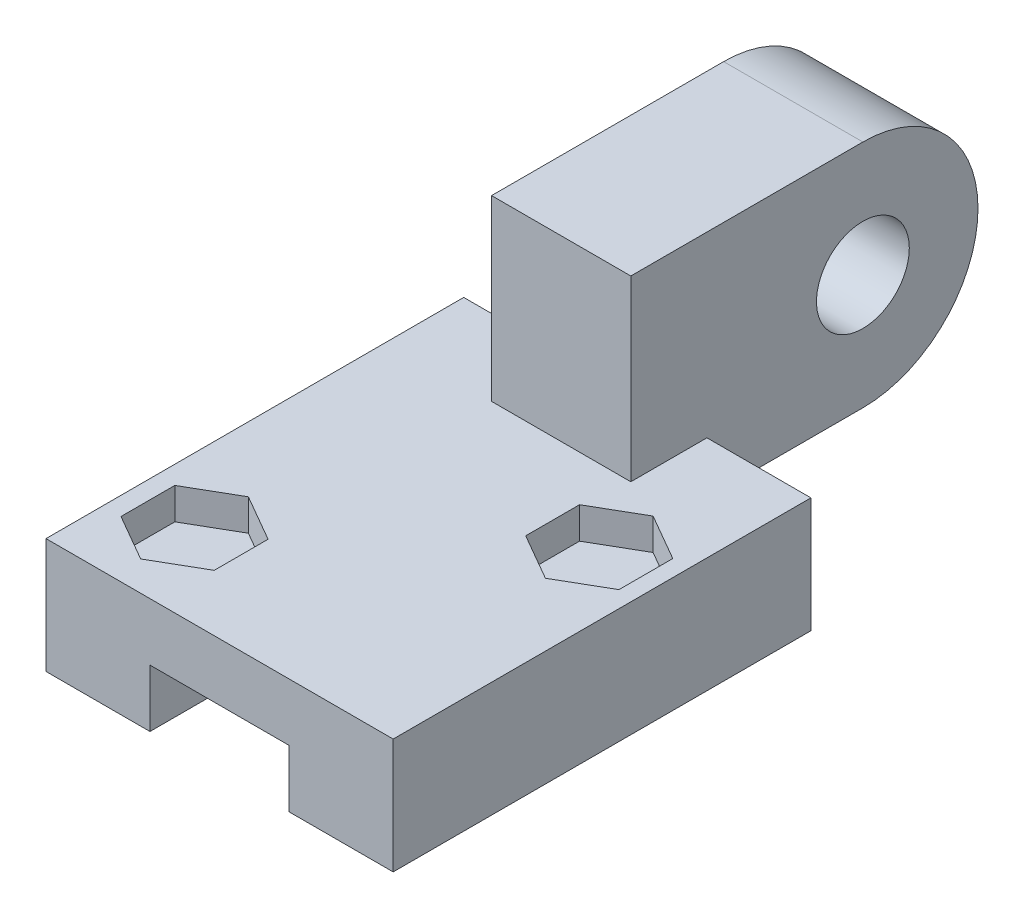
ISO-10303-21;
HEADER;
FILE_DESCRIPTION(('STEP AP214'),'2;1');
FILE_NAME('part.step','',(''),(''),'','','');
FILE_SCHEMA(('AUTOMOTIVE_DESIGN { 1 0 10303 214 1 1 1 1 }'));
ENDSEC;
DATA;
#1=APPLICATION_CONTEXT('core data for automotive mechanical design processes');
#2=APPLICATION_PROTOCOL_DEFINITION('international standard','automotive_design',2000,#1);
#3=PRODUCT_CONTEXT('',#1,'mechanical');
#4=PRODUCT('Part','Part','',(#3));
#5=PRODUCT_RELATED_PRODUCT_CATEGORY('part','',(#4));
#6=PRODUCT_DEFINITION_FORMATION('','',#4);
#7=PRODUCT_DEFINITION_CONTEXT('part definition',#1,'design');
#8=PRODUCT_DEFINITION('design','',#6,#7);
#9=PRODUCT_DEFINITION_SHAPE('','',#8);
#10=(LENGTH_UNIT() NAMED_UNIT(*) SI_UNIT(.MILLI.,.METRE.));
#11=(NAMED_UNIT(*) PLANE_ANGLE_UNIT() SI_UNIT($,.RADIAN.));
#12=(NAMED_UNIT(*) SI_UNIT($,.STERADIAN.) SOLID_ANGLE_UNIT());
#13=UNCERTAINTY_MEASURE_WITH_UNIT(LENGTH_MEASURE(1.E-05),#10,'distance_accuracy_value','');
#14=(GEOMETRIC_REPRESENTATION_CONTEXT(3) GLOBAL_UNCERTAINTY_ASSIGNED_CONTEXT((#13)) GLOBAL_UNIT_ASSIGNED_CONTEXT((#10,
#11,#12)) REPRESENTATION_CONTEXT('',''));
#15=CARTESIAN_POINT('',(0.,0.,0.));
#16=DIRECTION('',(0.,0.,1.));
#17=DIRECTION('',(1.,0.,0.));
#18=AXIS2_PLACEMENT_3D('',#15,#16,#17);
#19=CARTESIAN_POINT('',(0.,0.,2.25));
#20=DIRECTION('',(-1.,0.,0.));
#21=DIRECTION('',(0.,0.,1.));
#22=AXIS2_PLACEMENT_3D('',#19,#20,#21);
#23=PLANE('',#22);
#24=DIRECTION('',(0.,1.,0.));
#25=VECTOR('',#24,1.);
#26=CARTESIAN_POINT('',(0.,0.,0.));
#27=LINE('',#26,#25);
#28=CARTESIAN_POINT('',(0.,0.,0.));
#29=VERTEX_POINT('',#28);
#30=CARTESIAN_POINT('',(0.,0.62,0.));
#31=VERTEX_POINT('',#30);
#32=EDGE_CURVE('E351',#29,#31,#27,.T.);
#33=ORIENTED_EDGE('',*,*,#32,.T.);
#34=DIRECTION('',(0.,0.,-1.));
#35=VECTOR('',#34,1.);
#36=CARTESIAN_POINT('',(0.,0.62,2.25));
#37=LINE('',#36,#35);
#38=CARTESIAN_POINT('',(0.,0.62,2.25));
#39=VERTEX_POINT('',#38);
#40=EDGE_CURVE('E408',#39,#31,#37,.T.);
#41=ORIENTED_EDGE('',*,*,#40,.F.);
#42=DIRECTION('',(0.,1.,0.));
#43=VECTOR('',#42,1.);
#44=CARTESIAN_POINT('',(0.,0.,2.25));
#45=LINE('',#44,#43);
#46=CARTESIAN_POINT('',(0.,0.,2.25));
#47=VERTEX_POINT('',#46);
#48=EDGE_CURVE('E352',#47,#39,#45,.T.);
#49=ORIENTED_EDGE('',*,*,#48,.F.);
#50=DIRECTION('',(0.,0.,-1.));
#51=VECTOR('',#50,1.);
#52=CARTESIAN_POINT('',(0.,0.,2.25));
#53=LINE('',#52,#51);
#54=EDGE_CURVE('E370',#47,#29,#53,.T.);
#55=ORIENTED_EDGE('',*,*,#54,.T.);
#56=EDGE_LOOP('',(#33,#41,#49,#55));
#57=FACE_BOUND('',#56,.T.);
#58=ADVANCED_FACE('F38',(#57),#23,.F.);
#59=CARTESIAN_POINT('',(0.,0.62,2.25));
#60=DIRECTION('',(0.,-1.,0.));
#61=DIRECTION('',(1.,0.,0.));
#62=AXIS2_PLACEMENT_3D('',#59,#60,#61);
#63=PLANE('',#62);
#64=DIRECTION('',(0.,0.,-1.));
#65=VECTOR('',#64,1.);
#66=CARTESIAN_POINT('',(-0.0888526329025132,0.62,0.945));
#67=LINE('',#66,#65);
#68=CARTESIAN_POINT('',(-0.0888526329025132,0.62,0.945));
#69=VERTEX_POINT('',#68);
#70=CARTESIAN_POINT('',(-0.0888526329025133,0.62,0.655));
#71=VERTEX_POINT('',#70);
#72=EDGE_CURVE('E245',#69,#71,#67,.T.);
#73=ORIENTED_EDGE('',*,*,#72,.F.);
#74=DIRECTION('',(0.866025403784438,0.,-0.500000000000001));
#75=VECTOR('',#74,1.);
#76=CARTESIAN_POINT('',(-0.34,0.62,1.09));
#77=LINE('',#76,#75);
#78=CARTESIAN_POINT('',(-0.34,0.62,1.09));
#79=VERTEX_POINT('',#78);
#80=EDGE_CURVE('E52',#79,#69,#77,.T.);
#81=ORIENTED_EDGE('',*,*,#80,.F.);
#82=DIRECTION('',(0.866025403784438,0.,0.5));
#83=VECTOR('',#82,1.);
#84=CARTESIAN_POINT('',(-0.591147367097488,0.62,0.945));
#85=LINE('',#84,#83);
#86=CARTESIAN_POINT('',(-0.591147367097488,0.62,0.945));
#87=VERTEX_POINT('',#86);
#88=EDGE_CURVE('E231',#87,#79,#85,.T.);
#89=ORIENTED_EDGE('',*,*,#88,.F.);
#90=DIRECTION('',(0.,0.,1.));
#91=VECTOR('',#90,1.);
#92=CARTESIAN_POINT('',(-0.591147367097488,0.62,0.655));
#93=LINE('',#92,#91);
#94=CARTESIAN_POINT('',(-0.591147367097488,0.62,0.655));
#95=VERTEX_POINT('',#94);
#96=EDGE_CURVE('E234',#95,#87,#93,.T.);
#97=ORIENTED_EDGE('',*,*,#96,.F.);
#98=DIRECTION('',(-0.866025403784439,0.,0.5));
#99=VECTOR('',#98,1.);
#100=CARTESIAN_POINT('',(-0.34,0.62,0.51));
#101=LINE('',#100,#99);
#102=CARTESIAN_POINT('',(-0.34,0.62,0.51));
#103=VERTEX_POINT('',#102);
#104=EDGE_CURVE('E251',#103,#95,#101,.T.);
#105=ORIENTED_EDGE('',*,*,#104,.F.);
#106=DIRECTION('',(-0.866025403784439,0.,-0.5));
#107=VECTOR('',#106,1.);
#108=CARTESIAN_POINT('',(-0.0888526329025133,0.62,0.655));
#109=LINE('',#108,#107);
#110=EDGE_CURVE('E248',#71,#103,#109,.T.);
#111=ORIENTED_EDGE('',*,*,#110,.F.);
#112=EDGE_LOOP('',(#73,#81,#89,#97,#105,#111));
#113=FACE_BOUND('',#112,.T.);
#114=DIRECTION('',(0.,0.,-1.));
#115=VECTOR('',#114,1.);
#116=CARTESIAN_POINT('',(-1.26885263290251,0.62,1.945));
#117=LINE('',#116,#115);
#118=CARTESIAN_POINT('',(-1.26885263290251,0.62,1.945));
#119=VERTEX_POINT('',#118);
#120=CARTESIAN_POINT('',(-1.26885263290251,0.62,1.655));
#121=VERTEX_POINT('',#120);
#122=EDGE_CURVE('E287',#119,#121,#117,.T.);
#123=ORIENTED_EDGE('',*,*,#122,.F.);
#124=DIRECTION('',(0.866025403784437,0.,-0.500000000000002));
#125=VECTOR('',#124,1.);
#126=CARTESIAN_POINT('',(-1.52,0.62,2.09));
#127=LINE('',#126,#125);
#128=CARTESIAN_POINT('',(-1.52,0.62,2.09));
#129=VERTEX_POINT('',#128);
#130=EDGE_CURVE('E60',#129,#119,#127,.T.);
#131=ORIENTED_EDGE('',*,*,#130,.F.);
#132=DIRECTION('',(0.866025403784439,0.,0.5));
#133=VECTOR('',#132,1.);
#134=CARTESIAN_POINT('',(-1.77114736709749,0.62,1.945));
#135=LINE('',#134,#133);
#136=CARTESIAN_POINT('',(-1.77114736709749,0.62,1.945));
#137=VERTEX_POINT('',#136);
#138=EDGE_CURVE('E270',#137,#129,#135,.T.);
#139=ORIENTED_EDGE('',*,*,#138,.F.);
#140=DIRECTION('',(0.,0.,1.));
#141=VECTOR('',#140,1.);
#142=CARTESIAN_POINT('',(-1.77114736709749,0.62,1.655));
#143=LINE('',#142,#141);
#144=CARTESIAN_POINT('',(-1.77114736709749,0.62,1.655));
#145=VERTEX_POINT('',#144);
#146=EDGE_CURVE('E296',#145,#137,#143,.T.);
#147=ORIENTED_EDGE('',*,*,#146,.F.);
#148=DIRECTION('',(-0.866025403784438,0.,0.5));
#149=VECTOR('',#148,1.);
#150=CARTESIAN_POINT('',(-1.52,0.62,1.51));
#151=LINE('',#150,#149);
#152=CARTESIAN_POINT('',(-1.52,0.62,1.51));
#153=VERTEX_POINT('',#152);
#154=EDGE_CURVE('E293',#153,#145,#151,.T.);
#155=ORIENTED_EDGE('',*,*,#154,.F.);
#156=DIRECTION('',(-0.866025403784438,0.,-0.5));
#157=VECTOR('',#156,1.);
#158=CARTESIAN_POINT('',(-1.26885263290251,0.62,1.655));
#159=LINE('',#158,#157);
#160=EDGE_CURVE('E290',#121,#153,#159,.T.);
#161=ORIENTED_EDGE('',*,*,#160,.F.);
#162=EDGE_LOOP('',(#123,#131,#139,#147,#155,#161));
#163=FACE_BOUND('',#162,.T.);
#164=DIRECTION('',(-1.,0.,0.));
#165=VECTOR('',#164,1.);
#166=CARTESIAN_POINT('',(0.,0.62,0.));
#167=LINE('',#166,#165);
#168=CARTESIAN_POINT('',(-0.56,0.62,0.));
#169=VERTEX_POINT('',#168);
#170=EDGE_CURVE('E374',#31,#169,#167,.T.);
#171=ORIENTED_EDGE('',*,*,#170,.T.);
#172=DIRECTION('',(0.,0.,1.));
#173=VECTOR('',#172,1.);
#174=CARTESIAN_POINT('',(-0.56,0.62,2.25));
#175=LINE('',#174,#173);
#176=CARTESIAN_POINT('',(-0.56,0.62,0.41));
#177=VERTEX_POINT('',#176);
#178=EDGE_CURVE('E349',#169,#177,#175,.T.);
#179=ORIENTED_EDGE('',*,*,#178,.T.);
#180=DIRECTION('',(1.,0.,0.));
#181=VECTOR('',#180,1.);
#182=CARTESIAN_POINT('',(0.,0.62,0.41));
#183=LINE('',#182,#181);
#184=CARTESIAN_POINT('',(-1.31,0.62,0.41));
#185=VERTEX_POINT('',#184);
#186=EDGE_CURVE('E11',#185,#177,#183,.T.);
#187=ORIENTED_EDGE('',*,*,#186,.F.);
#188=DIRECTION('',(0.,0.,1.));
#189=VECTOR('',#188,1.);
#190=CARTESIAN_POINT('',(-1.31,0.62,2.25));
#191=LINE('',#190,#189);
#192=CARTESIAN_POINT('',(-1.31,0.62,0.));
#193=VERTEX_POINT('',#192);
#194=EDGE_CURVE('E346',#193,#185,#191,.T.);
#195=ORIENTED_EDGE('',*,*,#194,.F.);
#196=CARTESIAN_POINT('',(-1.87,0.62,0.));
#197=VERTEX_POINT('',#196);
#198=EDGE_CURVE('E373',#193,#197,#167,.T.);
#199=ORIENTED_EDGE('',*,*,#198,.T.);
#200=DIRECTION('',(0.,0.,-1.));
#201=VECTOR('',#200,1.);
#202=CARTESIAN_POINT('',(-1.87,0.62,2.25));
#203=LINE('',#202,#201);
#204=CARTESIAN_POINT('',(-1.87,0.62,2.25));
#205=VERTEX_POINT('',#204);
#206=EDGE_CURVE('E405',#205,#197,#203,.T.);
#207=ORIENTED_EDGE('',*,*,#206,.F.);
#208=DIRECTION('',(-1.,0.,0.));
#209=VECTOR('',#208,1.);
#210=CARTESIAN_POINT('',(0.,0.62,2.25));
#211=LINE('',#210,#209);
#212=EDGE_CURVE('E355',#39,#205,#211,.T.);
#213=ORIENTED_EDGE('',*,*,#212,.F.);
#214=ORIENTED_EDGE('',*,*,#40,.T.);
#215=EDGE_LOOP('',(#171,#179,#187,#195,#199,#207,#213,#214));
#216=FACE_BOUND('',#215,.T.);
#217=ADVANCED_FACE('F424',(#113,#163,#216),#63,.F.);
#218=CARTESIAN_POINT('',(-1.87,0.,2.25));
#219=DIRECTION('',(1.,0.,0.));
#220=DIRECTION('',(0.,0.,-1.));
#221=AXIS2_PLACEMENT_3D('',#218,#219,#220);
#222=PLANE('',#221);
#223=DIRECTION('',(0.,-1.,0.));
#224=VECTOR('',#223,1.);
#225=CARTESIAN_POINT('',(-1.87,0.,0.));
#226=LINE('',#225,#224);
#227=CARTESIAN_POINT('',(-1.87,0.,0.));
#228=VERTEX_POINT('',#227);
#229=EDGE_CURVE('E377',#197,#228,#226,.T.);
#230=ORIENTED_EDGE('',*,*,#229,.T.);
#231=DIRECTION('',(0.,0.,-1.));
#232=VECTOR('',#231,1.);
#233=CARTESIAN_POINT('',(-1.87,0.,2.25));
#234=LINE('',#233,#232);
#235=CARTESIAN_POINT('',(-1.87,0.,2.25));
#236=VERTEX_POINT('',#235);
#237=EDGE_CURVE('E402',#236,#228,#234,.T.);
#238=ORIENTED_EDGE('',*,*,#237,.F.);
#239=DIRECTION('',(0.,-1.,0.));
#240=VECTOR('',#239,1.);
#241=CARTESIAN_POINT('',(-1.87,0.,2.25));
#242=LINE('',#241,#240);
#243=EDGE_CURVE('E358',#205,#236,#242,.T.);
#244=ORIENTED_EDGE('',*,*,#243,.F.);
#245=ORIENTED_EDGE('',*,*,#206,.T.);
#246=EDGE_LOOP('',(#230,#238,#244,#245));
#247=FACE_BOUND('',#246,.T.);
#248=ADVANCED_FACE('F463',(#247),#222,.F.);
#249=CARTESIAN_POINT('',(-1.31,0.,2.25));
#250=DIRECTION('',(0.,1.,0.));
#251=DIRECTION('',(-1.,0.,0.));
#252=AXIS2_PLACEMENT_3D('',#249,#250,#251);
#253=PLANE('',#252);
#254=DIRECTION('',(1.,0.,0.));
#255=VECTOR('',#254,1.);
#256=CARTESIAN_POINT('',(-1.31,0.,0.));
#257=LINE('',#256,#255);
#258=CARTESIAN_POINT('',(-1.31,0.,0.));
#259=VERTEX_POINT('',#258);
#260=EDGE_CURVE('E379',#228,#259,#257,.T.);
#261=ORIENTED_EDGE('',*,*,#260,.T.);
#262=DIRECTION('',(0.,0.,-1.));
#263=VECTOR('',#262,1.);
#264=CARTESIAN_POINT('',(-1.31,0.,2.25));
#265=LINE('',#264,#263);
#266=CARTESIAN_POINT('',(-1.31,0.,2.25));
#267=VERTEX_POINT('',#266);
#268=EDGE_CURVE('E399',#267,#259,#265,.T.);
#269=ORIENTED_EDGE('',*,*,#268,.F.);
#270=DIRECTION('',(1.,0.,0.));
#271=VECTOR('',#270,1.);
#272=CARTESIAN_POINT('',(-1.31,0.,2.25));
#273=LINE('',#272,#271);
#274=EDGE_CURVE('E360',#236,#267,#273,.T.);
#275=ORIENTED_EDGE('',*,*,#274,.F.);
#276=ORIENTED_EDGE('',*,*,#237,.T.);
#277=EDGE_LOOP('',(#261,#269,#275,#276));
#278=FACE_BOUND('',#277,.T.);
#279=ADVANCED_FACE('F490',(#278),#253,.F.);
#280=CARTESIAN_POINT('',(-1.31,0.,2.25));
#281=DIRECTION('',(-1.,0.,0.));
#282=DIRECTION('',(0.,0.,1.));
#283=AXIS2_PLACEMENT_3D('',#280,#281,#282);
#284=PLANE('',#283);
#285=DIRECTION('',(0.,1.,0.));
#286=VECTOR('',#285,1.);
#287=CARTESIAN_POINT('',(-1.31,0.,0.));
#288=LINE('',#287,#286);
#289=CARTESIAN_POINT('',(-1.31,0.31,0.));
#290=VERTEX_POINT('',#289);
#291=EDGE_CURVE('E381',#259,#290,#288,.T.);
#292=ORIENTED_EDGE('',*,*,#291,.T.);
#293=DIRECTION('',(0.,0.,-1.));
#294=VECTOR('',#293,1.);
#295=CARTESIAN_POINT('',(-1.31,0.31,2.25));
#296=LINE('',#295,#294);
#297=CARTESIAN_POINT('',(-1.31,0.31,2.25));
#298=VERTEX_POINT('',#297);
#299=EDGE_CURVE('E396',#298,#290,#296,.T.);
#300=ORIENTED_EDGE('',*,*,#299,.F.);
#301=DIRECTION('',(0.,1.,0.));
#302=VECTOR('',#301,1.);
#303=CARTESIAN_POINT('',(-1.31,0.,2.25));
#304=LINE('',#303,#302);
#305=EDGE_CURVE('E362',#267,#298,#304,.T.);
#306=ORIENTED_EDGE('',*,*,#305,.F.);
#307=ORIENTED_EDGE('',*,*,#268,.T.);
#308=EDGE_LOOP('',(#292,#300,#306,#307));
#309=FACE_BOUND('',#308,.T.);
#310=ADVANCED_FACE('F485',(#309),#284,.F.);
#311=CARTESIAN_POINT('',(-0.56,0.31,2.25));
#312=DIRECTION('',(0.,1.,0.));
#313=DIRECTION('',(0.,0.,1.));
#314=AXIS2_PLACEMENT_3D('',#311,#312,#313);
#315=PLANE('',#314);
#316=DIRECTION('',(1.,0.,0.));
#317=VECTOR('',#316,1.);
#318=CARTESIAN_POINT('',(-0.56,0.31,0.));
#319=LINE('',#318,#317);
#320=CARTESIAN_POINT('',(-0.56,0.31,0.));
#321=VERTEX_POINT('',#320);
#322=EDGE_CURVE('E383',#290,#321,#319,.T.);
#323=ORIENTED_EDGE('',*,*,#322,.T.);
#324=DIRECTION('',(0.,0.,-1.));
#325=VECTOR('',#324,1.);
#326=CARTESIAN_POINT('',(-0.56,0.31,2.25));
#327=LINE('',#326,#325);
#328=CARTESIAN_POINT('',(-0.56,0.31,2.25));
#329=VERTEX_POINT('',#328);
#330=EDGE_CURVE('E393',#329,#321,#327,.T.);
#331=ORIENTED_EDGE('',*,*,#330,.F.);
#332=DIRECTION('',(1.,0.,0.));
#333=VECTOR('',#332,1.);
#334=CARTESIAN_POINT('',(-0.56,0.31,2.25));
#335=LINE('',#334,#333);
#336=EDGE_CURVE('E364',#298,#329,#335,.T.);
#337=ORIENTED_EDGE('',*,*,#336,.F.);
#338=ORIENTED_EDGE('',*,*,#299,.T.);
#339=EDGE_LOOP('',(#323,#331,#337,#338));
#340=FACE_BOUND('',#339,.T.);
#341=ADVANCED_FACE('F480',(#340),#315,.F.);
#342=CARTESIAN_POINT('',(-0.56,0.,2.25));
#343=DIRECTION('',(1.,0.,0.));
#344=DIRECTION('',(0.,0.,-1.));
#345=AXIS2_PLACEMENT_3D('',#342,#343,#344);
#346=PLANE('',#345);
#347=DIRECTION('',(0.,-1.,0.));
#348=VECTOR('',#347,1.);
#349=CARTESIAN_POINT('',(-0.56,0.,0.));
#350=LINE('',#349,#348);
#351=CARTESIAN_POINT('',(-0.56,0.,0.));
#352=VERTEX_POINT('',#351);
#353=EDGE_CURVE('E385',#321,#352,#350,.T.);
#354=ORIENTED_EDGE('',*,*,#353,.T.);
#355=DIRECTION('',(0.,0.,-1.));
#356=VECTOR('',#355,1.);
#357=CARTESIAN_POINT('',(-0.56,0.,2.25));
#358=LINE('',#357,#356);
#359=CARTESIAN_POINT('',(-0.56,0.,2.25));
#360=VERTEX_POINT('',#359);
#361=EDGE_CURVE('E390',#360,#352,#358,.T.);
#362=ORIENTED_EDGE('',*,*,#361,.F.);
#363=DIRECTION('',(0.,-1.,0.));
#364=VECTOR('',#363,1.);
#365=CARTESIAN_POINT('',(-0.56,0.,2.25));
#366=LINE('',#365,#364);
#367=EDGE_CURVE('E366',#329,#360,#366,.T.);
#368=ORIENTED_EDGE('',*,*,#367,.F.);
#369=ORIENTED_EDGE('',*,*,#330,.T.);
#370=EDGE_LOOP('',(#354,#362,#368,#369));
#371=FACE_BOUND('',#370,.T.);
#372=ADVANCED_FACE('F476',(#371),#346,.F.);
#373=CARTESIAN_POINT('',(0.,0.,2.25));
#374=DIRECTION('',(0.,1.,0.));
#375=DIRECTION('',(-1.,0.,0.));
#376=AXIS2_PLACEMENT_3D('',#373,#374,#375);
#377=PLANE('',#376);
#378=DIRECTION('',(1.,0.,0.));
#379=VECTOR('',#378,1.);
#380=CARTESIAN_POINT('',(0.,0.,0.));
#381=LINE('',#380,#379);
#382=EDGE_CURVE('E356',#352,#29,#381,.T.);
#383=ORIENTED_EDGE('',*,*,#382,.T.);
#384=ORIENTED_EDGE('',*,*,#54,.F.);
#385=DIRECTION('',(1.,0.,0.));
#386=VECTOR('',#385,1.);
#387=CARTESIAN_POINT('',(0.,0.,2.25));
#388=LINE('',#387,#386);
#389=EDGE_CURVE('E368',#360,#47,#388,.T.);
#390=ORIENTED_EDGE('',*,*,#389,.F.);
#391=ORIENTED_EDGE('',*,*,#361,.T.);
#392=EDGE_LOOP('',(#383,#384,#390,#391));
#393=FACE_BOUND('',#392,.T.);
#394=ADVANCED_FACE('F471',(#393),#377,.F.);
#395=CARTESIAN_POINT('',(0.,0.,2.25));
#396=DIRECTION('',(0.,0.,1.));
#397=DIRECTION('',(1.,0.,0.));
#398=AXIS2_PLACEMENT_3D('',#395,#396,#397);
#399=PLANE('',#398);
#400=ORIENTED_EDGE('',*,*,#48,.T.);
#401=ORIENTED_EDGE('',*,*,#212,.T.);
#402=ORIENTED_EDGE('',*,*,#243,.T.);
#403=ORIENTED_EDGE('',*,*,#274,.T.);
#404=ORIENTED_EDGE('',*,*,#305,.T.);
#405=ORIENTED_EDGE('',*,*,#336,.T.);
#406=ORIENTED_EDGE('',*,*,#367,.T.);
#407=ORIENTED_EDGE('',*,*,#389,.T.);
#408=EDGE_LOOP('',(#400,#401,#402,#403,#404,#405,#406,#407));
#409=FACE_BOUND('',#408,.T.);
#410=ADVANCED_FACE('F496',(#409),#399,.T.);
#411=CARTESIAN_POINT('',(0.,0.,0.));
#412=DIRECTION('',(0.,0.,1.));
#413=DIRECTION('',(1.,0.,0.));
#414=AXIS2_PLACEMENT_3D('',#411,#412,#413);
#415=PLANE('',#414);
#416=DIRECTION('',(-1.,0.,0.));
#417=VECTOR('',#416,1.);
#418=CARTESIAN_POINT('',(0.,0.34,0.));
#419=LINE('',#418,#417);
#420=CARTESIAN_POINT('',(-0.56,0.34,0.));
#421=VERTEX_POINT('',#420);
#422=CARTESIAN_POINT('',(-1.31,0.34,0.));
#423=VERTEX_POINT('',#422);
#424=EDGE_CURVE('E411',#421,#423,#419,.T.);
#425=ORIENTED_EDGE('',*,*,#424,.F.);
#426=DIRECTION('',(0.,1.,0.));
#427=VECTOR('',#426,1.);
#428=CARTESIAN_POINT('',(-0.56,0.,0.));
#429=LINE('',#428,#427);
#430=EDGE_CURVE('E45',#421,#169,#429,.T.);
#431=ORIENTED_EDGE('',*,*,#430,.T.);
#432=ORIENTED_EDGE('',*,*,#170,.F.);
#433=ORIENTED_EDGE('',*,*,#32,.F.);
#434=ORIENTED_EDGE('',*,*,#382,.F.);
#435=ORIENTED_EDGE('',*,*,#353,.F.);
#436=ORIENTED_EDGE('',*,*,#322,.F.);
#437=ORIENTED_EDGE('',*,*,#291,.F.);
#438=ORIENTED_EDGE('',*,*,#260,.F.);
#439=ORIENTED_EDGE('',*,*,#229,.F.);
#440=ORIENTED_EDGE('',*,*,#198,.F.);
#441=DIRECTION('',(0.,1.,0.));
#442=VECTOR('',#441,1.);
#443=CARTESIAN_POINT('',(-1.31,0.,0.));
#444=LINE('',#443,#442);
#445=EDGE_CURVE('E414',#423,#193,#444,.T.);
#446=ORIENTED_EDGE('',*,*,#445,.F.);
#447=EDGE_LOOP('',(#425,#431,#432,#433,#434,#435,#436,#437,#438,#439,#440,#446));
#448=FACE_BOUND('',#447,.T.);
#449=ADVANCED_FACE('F418',(#448),#415,.F.);
#450=CARTESIAN_POINT('',(-0.56,0.34,0.41));
#451=DIRECTION('',(0.,0.,-1.));
#452=DIRECTION('',(0.,1.,0.));
#453=AXIS2_PLACEMENT_3D('',#450,#451,#452);
#454=PLANE('',#453);
#455=DIRECTION('',(0.,-1.,0.));
#456=VECTOR('',#455,1.);
#457=CARTESIAN_POINT('',(-1.31,0.34,0.41));
#458=LINE('',#457,#456);
#459=CARTESIAN_POINT('',(-1.31,1.58,0.41));
#460=VERTEX_POINT('',#459);
#461=EDGE_CURVE('E334',#460,#185,#458,.T.);
#462=ORIENTED_EDGE('',*,*,#461,.T.);
#463=ORIENTED_EDGE('',*,*,#186,.T.);
#464=DIRECTION('',(0.,-1.,0.));
#465=VECTOR('',#464,1.);
#466=CARTESIAN_POINT('',(-0.56,1.58,0.41));
#467=LINE('',#466,#465);
#468=CARTESIAN_POINT('',(-0.56,1.58,0.41));
#469=VERTEX_POINT('',#468);
#470=EDGE_CURVE('E323',#469,#177,#467,.T.);
#471=ORIENTED_EDGE('',*,*,#470,.F.);
#472=DIRECTION('',(-1.,0.,0.));
#473=VECTOR('',#472,1.);
#474=CARTESIAN_POINT('',(-0.56,1.58,0.41));
#475=LINE('',#474,#473);
#476=EDGE_CURVE('E340',#469,#460,#475,.T.);
#477=ORIENTED_EDGE('',*,*,#476,.T.);
#478=EDGE_LOOP('',(#462,#463,#471,#477));
#479=FACE_BOUND('',#478,.T.);
#480=ADVANCED_FACE('F430',(#479),#454,.F.);
#481=CARTESIAN_POINT('',(-0.56,0.96,-0.84));
#482=DIRECTION('',(1.,0.,0.));
#483=DIRECTION('',(0.,0.,-1.));
#484=AXIS2_PLACEMENT_3D('',#481,#482,#483);
#485=PLANE('',#484);
#486=CARTESIAN_POINT('',(-0.56,0.96,-0.84));
#487=DIRECTION('',(1.,0.,0.));
#488=DIRECTION('',(0.,0.,-1.));
#489=AXIS2_PLACEMENT_3D('',#486,#487,#488);
#490=CIRCLE('',#489,0.25);
#491=CARTESIAN_POINT('',(-0.56,0.96,-1.09));
#492=VERTEX_POINT('',#491);
#493=EDGE_CURVE('E311',#492,#492,#490,.T.);
#494=ORIENTED_EDGE('',*,*,#493,.F.);
#495=EDGE_LOOP('',(#494));
#496=FACE_BOUND('',#495,.T.);
#497=ORIENTED_EDGE('',*,*,#178,.F.);
#498=ORIENTED_EDGE('',*,*,#430,.F.);
#499=DIRECTION('',(0.,0.,-1.));
#500=VECTOR('',#499,1.);
#501=CARTESIAN_POINT('',(-0.56,0.34,-0.84));
#502=LINE('',#501,#500);
#503=CARTESIAN_POINT('',(-0.56,0.34,-0.84));
#504=VERTEX_POINT('',#503);
#505=EDGE_CURVE('E326',#421,#504,#502,.T.);
#506=ORIENTED_EDGE('',*,*,#505,.T.);
#507=CARTESIAN_POINT('',(-0.56,0.96,-0.84));
#508=DIRECTION('',(1.,0.,0.));
#509=DIRECTION('',(0.,0.,-1.));
#510=AXIS2_PLACEMENT_3D('',#507,#508,#509);
#511=CIRCLE('',#510,0.62);
#512=CARTESIAN_POINT('',(-0.56,1.58,-0.84));
#513=VERTEX_POINT('',#512);
#514=EDGE_CURVE('E317',#504,#513,#511,.T.);
#515=ORIENTED_EDGE('',*,*,#514,.T.);
#516=DIRECTION('',(0.,0.,1.));
#517=VECTOR('',#516,1.);
#518=CARTESIAN_POINT('',(-0.56,1.58,-0.84));
#519=LINE('',#518,#517);
#520=EDGE_CURVE('E320',#513,#469,#519,.T.);
#521=ORIENTED_EDGE('',*,*,#520,.T.);
#522=ORIENTED_EDGE('',*,*,#470,.T.);
#523=EDGE_LOOP('',(#497,#498,#506,#515,#521,#522));
#524=FACE_BOUND('',#523,.T.);
#525=ADVANCED_FACE('F426',(#496,#524),#485,.T.);
#526=CARTESIAN_POINT('',(-1.31,0.96,-0.84));
#527=DIRECTION('',(1.,0.,0.));
#528=DIRECTION('',(0.,0.,-1.));
#529=AXIS2_PLACEMENT_3D('',#526,#527,#528);
#530=PLANE('',#529);
#531=CARTESIAN_POINT('',(-1.31,0.96,-0.84));
#532=DIRECTION('',(1.,0.,0.));
#533=DIRECTION('',(0.,0.,-1.));
#534=AXIS2_PLACEMENT_3D('',#531,#532,#533);
#535=CIRCLE('',#534,0.25);
#536=CARTESIAN_POINT('',(-1.31,0.96,-1.09));
#537=VERTEX_POINT('',#536);
#538=EDGE_CURVE('E258',#537,#537,#535,.T.);
#539=ORIENTED_EDGE('',*,*,#538,.T.);
#540=EDGE_LOOP('',(#539));
#541=FACE_BOUND('',#540,.T.);
#542=ORIENTED_EDGE('',*,*,#445,.T.);
#543=ORIENTED_EDGE('',*,*,#194,.T.);
#544=ORIENTED_EDGE('',*,*,#461,.F.);
#545=DIRECTION('',(0.,0.,1.));
#546=VECTOR('',#545,1.);
#547=CARTESIAN_POINT('',(-1.31,1.58,-0.84));
#548=LINE('',#547,#546);
#549=CARTESIAN_POINT('',(-1.31,1.58,-0.84));
#550=VERTEX_POINT('',#549);
#551=EDGE_CURVE('E331',#550,#460,#548,.T.);
#552=ORIENTED_EDGE('',*,*,#551,.F.);
#553=CARTESIAN_POINT('',(-1.31,0.96,-0.84));
#554=DIRECTION('',(1.,0.,0.));
#555=DIRECTION('',(0.,0.,-1.));
#556=AXIS2_PLACEMENT_3D('',#553,#554,#555);
#557=CIRCLE('',#556,0.62);
#558=CARTESIAN_POINT('',(-1.31,0.34,-0.84));
#559=VERTEX_POINT('',#558);
#560=EDGE_CURVE('E314',#559,#550,#557,.T.);
#561=ORIENTED_EDGE('',*,*,#560,.F.);
#562=DIRECTION('',(0.,0.,-1.));
#563=VECTOR('',#562,1.);
#564=CARTESIAN_POINT('',(-1.31,0.34,-0.84));
#565=LINE('',#564,#563);
#566=EDGE_CURVE('E321',#423,#559,#565,.T.);
#567=ORIENTED_EDGE('',*,*,#566,.F.);
#568=EDGE_LOOP('',(#542,#543,#544,#552,#561,#567));
#569=FACE_BOUND('',#568,.T.);
#570=ADVANCED_FACE('F433',(#541,#569),#530,.F.);
#571=CARTESIAN_POINT('',(-0.56,0.34,-0.84));
#572=DIRECTION('',(0.,1.,0.));
#573=DIRECTION('',(0.,0.,1.));
#574=AXIS2_PLACEMENT_3D('',#571,#572,#573);
#575=PLANE('',#574);
#576=ORIENTED_EDGE('',*,*,#505,.F.);
#577=ORIENTED_EDGE('',*,*,#424,.T.);
#578=ORIENTED_EDGE('',*,*,#566,.T.);
#579=DIRECTION('',(-1.,0.,0.));
#580=VECTOR('',#579,1.);
#581=CARTESIAN_POINT('',(-0.56,0.34,-0.84));
#582=LINE('',#581,#580);
#583=EDGE_CURVE('E328',#504,#559,#582,.T.);
#584=ORIENTED_EDGE('',*,*,#583,.F.);
#585=EDGE_LOOP('',(#576,#577,#578,#584));
#586=FACE_BOUND('',#585,.T.);
#587=ADVANCED_FACE('F438',(#586),#575,.F.);
#588=CARTESIAN_POINT('',(-0.56,0.96,-0.84));
#589=DIRECTION('',(-1.,0.,0.));
#590=DIRECTION('',(0.,0.,1.));
#591=AXIS2_PLACEMENT_3D('',#588,#589,#590);
#592=CYLINDRICAL_SURFACE('',#591,0.62);
#593=ORIENTED_EDGE('',*,*,#560,.T.);
#594=DIRECTION('',(-1.,0.,0.));
#595=VECTOR('',#594,1.);
#596=CARTESIAN_POINT('',(-0.56,1.58,-0.84));
#597=LINE('',#596,#595);
#598=EDGE_CURVE('E343',#513,#550,#597,.T.);
#599=ORIENTED_EDGE('',*,*,#598,.F.);
#600=ORIENTED_EDGE('',*,*,#514,.F.);
#601=ORIENTED_EDGE('',*,*,#583,.T.);
#602=EDGE_LOOP('',(#593,#599,#600,#601));
#603=FACE_BOUND('',#602,.T.);
#604=ADVANCED_FACE('F443',(#603),#592,.T.);
#605=CARTESIAN_POINT('',(-0.56,1.58,-0.84));
#606=DIRECTION('',(0.,-1.,0.));
#607=DIRECTION('',(0.,0.,-1.));
#608=AXIS2_PLACEMENT_3D('',#605,#606,#607);
#609=PLANE('',#608);
#610=ORIENTED_EDGE('',*,*,#551,.T.);
#611=ORIENTED_EDGE('',*,*,#476,.F.);
#612=ORIENTED_EDGE('',*,*,#520,.F.);
#613=ORIENTED_EDGE('',*,*,#598,.T.);
#614=EDGE_LOOP('',(#610,#611,#612,#613));
#615=FACE_BOUND('',#614,.T.);
#616=ADVANCED_FACE('F445',(#615),#609,.F.);
#617=CARTESIAN_POINT('',(-0.56,0.96,-0.84));
#618=DIRECTION('',(-1.,0.,0.));
#619=DIRECTION('',(0.,0.,1.));
#620=AXIS2_PLACEMENT_3D('',#617,#618,#619);
#621=CYLINDRICAL_SURFACE('',#620,0.25);
#622=ORIENTED_EDGE('',*,*,#493,.T.);
#623=EDGE_LOOP('',(#622));
#624=FACE_BOUND('',#623,.T.);
#625=ORIENTED_EDGE('',*,*,#538,.F.);
#626=EDGE_LOOP('',(#625));
#627=FACE_BOUND('',#626,.T.);
#628=ADVANCED_FACE('F447',(#624,#627),#621,.F.);
#629=CARTESIAN_POINT('',(-1.52,0.45,2.09));
#630=DIRECTION('',(0.500000000000002,0.,0.866025403784437));
#631=DIRECTION('',(0.866025403784437,0.,-0.500000000000002));
#632=AXIS2_PLACEMENT_3D('',#629,#630,#631);
#633=PLANE('',#632);
#634=ORIENTED_EDGE('',*,*,#130,.T.);
#635=DIRECTION('',(0.,1.,0.));
#636=VECTOR('',#635,1.);
#637=CARTESIAN_POINT('',(-1.26885263290251,0.45,1.945));
#638=LINE('',#637,#636);
#639=CARTESIAN_POINT('',(-1.26885263290251,0.45,1.945));
#640=VERTEX_POINT('',#639);
#641=EDGE_CURVE('E285',#640,#119,#638,.T.);
#642=ORIENTED_EDGE('',*,*,#641,.F.);
#643=DIRECTION('',(0.866025403784437,0.,-0.500000000000002));
#644=VECTOR('',#643,1.);
#645=CARTESIAN_POINT('',(-1.52,0.45,2.09));
#646=LINE('',#645,#644);
#647=CARTESIAN_POINT('',(-1.52,0.45,2.09));
#648=VERTEX_POINT('',#647);
#649=EDGE_CURVE('E266',#648,#640,#646,.T.);
#650=ORIENTED_EDGE('',*,*,#649,.F.);
#651=DIRECTION('',(0.,1.,0.));
#652=VECTOR('',#651,1.);
#653=CARTESIAN_POINT('',(-1.52,0.45,2.09));
#654=LINE('',#653,#652);
#655=EDGE_CURVE('E246',#648,#129,#654,.T.);
#656=ORIENTED_EDGE('',*,*,#655,.T.);
#657=EDGE_LOOP('',(#634,#642,#650,#656));
#658=FACE_BOUND('',#657,.T.);
#659=ADVANCED_FACE('F453',(#658),#633,.F.);
#660=CARTESIAN_POINT('',(-1.77114736709749,0.45,1.945));
#661=DIRECTION('',(-0.5,0.,0.866025403784439));
#662=DIRECTION('',(0.866025403784439,0.,0.5));
#663=AXIS2_PLACEMENT_3D('',#660,#661,#662);
#664=PLANE('',#663);
#665=ORIENTED_EDGE('',*,*,#138,.T.);
#666=ORIENTED_EDGE('',*,*,#655,.F.);
#667=DIRECTION('',(0.866025403784439,0.,0.5));
#668=VECTOR('',#667,1.);
#669=CARTESIAN_POINT('',(-1.77114736709749,0.45,1.945));
#670=LINE('',#669,#668);
#671=CARTESIAN_POINT('',(-1.77114736709749,0.45,1.945));
#672=VERTEX_POINT('',#671);
#673=EDGE_CURVE('E282',#672,#648,#670,.T.);
#674=ORIENTED_EDGE('',*,*,#673,.F.);
#675=DIRECTION('',(0.,1.,0.));
#676=VECTOR('',#675,1.);
#677=CARTESIAN_POINT('',(-1.77114736709749,0.45,1.945));
#678=LINE('',#677,#676);
#679=EDGE_CURVE('E302',#672,#137,#678,.T.);
#680=ORIENTED_EDGE('',*,*,#679,.T.);
#681=EDGE_LOOP('',(#665,#666,#674,#680));
#682=FACE_BOUND('',#681,.T.);
#683=ADVANCED_FACE('F613',(#682),#664,.F.);
#684=CARTESIAN_POINT('',(-1.77114736709749,0.45,1.655));
#685=DIRECTION('',(-1.,0.,0.));
#686=DIRECTION('',(0.,-1.,0.));
#687=AXIS2_PLACEMENT_3D('',#684,#685,#686);
#688=PLANE('',#687);
#689=ORIENTED_EDGE('',*,*,#146,.T.);
#690=ORIENTED_EDGE('',*,*,#679,.F.);
#691=DIRECTION('',(0.,0.,1.));
#692=VECTOR('',#691,1.);
#693=CARTESIAN_POINT('',(-1.77114736709749,0.45,1.655));
#694=LINE('',#693,#692);
#695=CARTESIAN_POINT('',(-1.77114736709749,0.45,1.655));
#696=VERTEX_POINT('',#695);
#697=EDGE_CURVE('E279',#696,#672,#694,.T.);
#698=ORIENTED_EDGE('',*,*,#697,.F.);
#699=DIRECTION('',(0.,1.,0.));
#700=VECTOR('',#699,1.);
#701=CARTESIAN_POINT('',(-1.77114736709749,0.45,1.655));
#702=LINE('',#701,#700);
#703=EDGE_CURVE('E304',#696,#145,#702,.T.);
#704=ORIENTED_EDGE('',*,*,#703,.T.);
#705=EDGE_LOOP('',(#689,#690,#698,#704));
#706=FACE_BOUND('',#705,.T.);
#707=ADVANCED_FACE('F622',(#706),#688,.F.);
#708=CARTESIAN_POINT('',(-1.52,0.45,1.51));
#709=DIRECTION('',(-0.5,0.,-0.866025403784438));
#710=DIRECTION('',(-0.866025403784439,0.,0.5));
#711=AXIS2_PLACEMENT_3D('',#708,#709,#710);
#712=PLANE('',#711);
#713=ORIENTED_EDGE('',*,*,#154,.T.);
#714=ORIENTED_EDGE('',*,*,#703,.F.);
#715=DIRECTION('',(-0.866025403784438,0.,0.5));
#716=VECTOR('',#715,1.);
#717=CARTESIAN_POINT('',(-1.52,0.45,1.51));
#718=LINE('',#717,#716);
#719=CARTESIAN_POINT('',(-1.52,0.45,1.51));
#720=VERTEX_POINT('',#719);
#721=EDGE_CURVE('E276',#720,#696,#718,.T.);
#722=ORIENTED_EDGE('',*,*,#721,.F.);
#723=DIRECTION('',(0.,1.,0.));
#724=VECTOR('',#723,1.);
#725=CARTESIAN_POINT('',(-1.52,0.45,1.51));
#726=LINE('',#725,#724);
#727=EDGE_CURVE('E306',#720,#153,#726,.T.);
#728=ORIENTED_EDGE('',*,*,#727,.T.);
#729=EDGE_LOOP('',(#713,#714,#722,#728));
#730=FACE_BOUND('',#729,.T.);
#731=ADVANCED_FACE('F632',(#730),#712,.F.);
#732=CARTESIAN_POINT('',(-1.26885263290251,0.45,1.655));
#733=DIRECTION('',(0.5,0.,-0.866025403784438));
#734=DIRECTION('',(-0.866025403784439,0.,-0.5));
#735=AXIS2_PLACEMENT_3D('',#732,#733,#734);
#736=PLANE('',#735);
#737=ORIENTED_EDGE('',*,*,#160,.T.);
#738=ORIENTED_EDGE('',*,*,#727,.F.);
#739=DIRECTION('',(-0.866025403784438,0.,-0.5));
#740=VECTOR('',#739,1.);
#741=CARTESIAN_POINT('',(-1.26885263290251,0.45,1.655));
#742=LINE('',#741,#740);
#743=CARTESIAN_POINT('',(-1.26885263290251,0.45,1.655));
#744=VERTEX_POINT('',#743);
#745=EDGE_CURVE('E273',#744,#720,#742,.T.);
#746=ORIENTED_EDGE('',*,*,#745,.F.);
#747=DIRECTION('',(0.,1.,0.));
#748=VECTOR('',#747,1.);
#749=CARTESIAN_POINT('',(-1.26885263290251,0.45,1.655));
#750=LINE('',#749,#748);
#751=EDGE_CURVE('E308',#744,#121,#750,.T.);
#752=ORIENTED_EDGE('',*,*,#751,.T.);
#753=EDGE_LOOP('',(#737,#738,#746,#752));
#754=FACE_BOUND('',#753,.T.);
#755=ADVANCED_FACE('F642',(#754),#736,.F.);
#756=CARTESIAN_POINT('',(-1.26885263290251,0.45,1.945));
#757=DIRECTION('',(1.,0.,0.));
#758=DIRECTION('',(0.,1.,0.));
#759=AXIS2_PLACEMENT_3D('',#756,#757,#758);
#760=PLANE('',#759);
#761=ORIENTED_EDGE('',*,*,#122,.T.);
#762=ORIENTED_EDGE('',*,*,#751,.F.);
#763=DIRECTION('',(0.,0.,-1.));
#764=VECTOR('',#763,1.);
#765=CARTESIAN_POINT('',(-1.26885263290251,0.45,1.945));
#766=LINE('',#765,#764);
#767=EDGE_CURVE('E269',#640,#744,#766,.T.);
#768=ORIENTED_EDGE('',*,*,#767,.F.);
#769=ORIENTED_EDGE('',*,*,#641,.T.);
#770=EDGE_LOOP('',(#761,#762,#768,#769));
#771=FACE_BOUND('',#770,.T.);
#772=ADVANCED_FACE('F652',(#771),#760,.F.);
#773=CARTESIAN_POINT('',(0.,0.45,0.));
#774=DIRECTION('',(0.,1.,0.));
#775=DIRECTION('',(-1.,0.,0.));
#776=AXIS2_PLACEMENT_3D('',#773,#774,#775);
#777=PLANE('',#776);
#778=ORIENTED_EDGE('',*,*,#649,.T.);
#779=ORIENTED_EDGE('',*,*,#767,.T.);
#780=ORIENTED_EDGE('',*,*,#745,.T.);
#781=ORIENTED_EDGE('',*,*,#721,.T.);
#782=ORIENTED_EDGE('',*,*,#697,.T.);
#783=ORIENTED_EDGE('',*,*,#673,.T.);
#784=EDGE_LOOP('',(#778,#779,#780,#781,#782,#783));
#785=FACE_BOUND('',#784,.T.);
#786=ADVANCED_FACE('F662',(#785),#777,.T.);
#787=CARTESIAN_POINT('',(-0.34,0.45,1.09));
#788=DIRECTION('',(0.500000000000001,0.,0.866025403784438));
#789=DIRECTION('',(0.866025403784438,0.,-0.500000000000001));
#790=AXIS2_PLACEMENT_3D('',#787,#788,#789);
#791=PLANE('',#790);
#792=ORIENTED_EDGE('',*,*,#80,.T.);
#793=DIRECTION('',(0.,1.,0.));
#794=VECTOR('',#793,1.);
#795=CARTESIAN_POINT('',(-0.0888526329025132,0.45,0.945));
#796=LINE('',#795,#794);
#797=CARTESIAN_POINT('',(-0.0888526329025132,0.45,0.945));
#798=VERTEX_POINT('',#797);
#799=EDGE_CURVE('E208',#798,#69,#796,.T.);
#800=ORIENTED_EDGE('',*,*,#799,.F.);
#801=DIRECTION('',(0.866025403784438,0.,-0.500000000000001));
#802=VECTOR('',#801,1.);
#803=CARTESIAN_POINT('',(-0.34,0.45,1.09));
#804=LINE('',#803,#802);
#805=CARTESIAN_POINT('',(-0.34,0.45,1.09));
#806=VERTEX_POINT('',#805);
#807=EDGE_CURVE('E212',#806,#798,#804,.T.);
#808=ORIENTED_EDGE('',*,*,#807,.F.);
#809=DIRECTION('',(0.,1.,0.));
#810=VECTOR('',#809,1.);
#811=CARTESIAN_POINT('',(-0.34,0.45,1.09));
#812=LINE('',#811,#810);
#813=EDGE_CURVE('E256',#806,#79,#812,.T.);
#814=ORIENTED_EDGE('',*,*,#813,.T.);
#815=EDGE_LOOP('',(#792,#800,#808,#814));
#816=FACE_BOUND('',#815,.T.);
#817=ADVANCED_FACE('F210',(#816),#791,.F.);
#818=CARTESIAN_POINT('',(-0.591147367097488,0.45,0.945));
#819=DIRECTION('',(-0.5,0.,0.866025403784438));
#820=DIRECTION('',(0.866025403784439,0.,0.5));
#821=AXIS2_PLACEMENT_3D('',#818,#819,#820);
#822=PLANE('',#821);
#823=ORIENTED_EDGE('',*,*,#88,.T.);
#824=ORIENTED_EDGE('',*,*,#813,.F.);
#825=DIRECTION('',(0.866025403784438,0.,0.5));
#826=VECTOR('',#825,1.);
#827=CARTESIAN_POINT('',(-0.591147367097488,0.45,0.945));
#828=LINE('',#827,#826);
#829=CARTESIAN_POINT('',(-0.591147367097488,0.45,0.945));
#830=VERTEX_POINT('',#829);
#831=EDGE_CURVE('E218',#830,#806,#828,.T.);
#832=ORIENTED_EDGE('',*,*,#831,.F.);
#833=DIRECTION('',(0.,1.,0.));
#834=VECTOR('',#833,1.);
#835=CARTESIAN_POINT('',(-0.591147367097488,0.45,0.945));
#836=LINE('',#835,#834);
#837=EDGE_CURVE('E259',#830,#87,#836,.T.);
#838=ORIENTED_EDGE('',*,*,#837,.T.);
#839=EDGE_LOOP('',(#823,#824,#832,#838));
#840=FACE_BOUND('',#839,.T.);
#841=ADVANCED_FACE('F681',(#840),#822,.F.);
#842=CARTESIAN_POINT('',(-0.591147367097488,0.45,0.655));
#843=DIRECTION('',(-1.,0.,0.));
#844=DIRECTION('',(0.,-1.,0.));
#845=AXIS2_PLACEMENT_3D('',#842,#843,#844);
#846=PLANE('',#845);
#847=ORIENTED_EDGE('',*,*,#96,.T.);
#848=ORIENTED_EDGE('',*,*,#837,.F.);
#849=DIRECTION('',(0.,0.,1.));
#850=VECTOR('',#849,1.);
#851=CARTESIAN_POINT('',(-0.591147367097488,0.45,0.655));
#852=LINE('',#851,#850);
#853=CARTESIAN_POINT('',(-0.591147367097488,0.45,0.655));
#854=VERTEX_POINT('',#853);
#855=EDGE_CURVE('E241',#854,#830,#852,.T.);
#856=ORIENTED_EDGE('',*,*,#855,.F.);
#857=DIRECTION('',(0.,1.,0.));
#858=VECTOR('',#857,1.);
#859=CARTESIAN_POINT('',(-0.591147367097488,0.45,0.655));
#860=LINE('',#859,#858);
#861=EDGE_CURVE('E261',#854,#95,#860,.T.);
#862=ORIENTED_EDGE('',*,*,#861,.T.);
#863=EDGE_LOOP('',(#847,#848,#856,#862));
#864=FACE_BOUND('',#863,.T.);
#865=ADVANCED_FACE('F690',(#864),#846,.F.);
#866=CARTESIAN_POINT('',(-0.34,0.45,0.51));
#867=DIRECTION('',(-0.5,0.,-0.866025403784439));
#868=DIRECTION('',(-0.866025403784439,0.,0.5));
#869=AXIS2_PLACEMENT_3D('',#866,#867,#868);
#870=PLANE('',#869);
#871=ORIENTED_EDGE('',*,*,#104,.T.);
#872=ORIENTED_EDGE('',*,*,#861,.F.);
#873=DIRECTION('',(-0.866025403784439,0.,0.5));
#874=VECTOR('',#873,1.);
#875=CARTESIAN_POINT('',(-0.34,0.45,0.51));
#876=LINE('',#875,#874);
#877=CARTESIAN_POINT('',(-0.34,0.45,0.51));
#878=VERTEX_POINT('',#877);
#879=EDGE_CURVE('E238',#878,#854,#876,.T.);
#880=ORIENTED_EDGE('',*,*,#879,.F.);
#881=DIRECTION('',(0.,1.,0.));
#882=VECTOR('',#881,1.);
#883=CARTESIAN_POINT('',(-0.34,0.45,0.51));
#884=LINE('',#883,#882);
#885=EDGE_CURVE('E263',#878,#103,#884,.T.);
#886=ORIENTED_EDGE('',*,*,#885,.T.);
#887=EDGE_LOOP('',(#871,#872,#880,#886));
#888=FACE_BOUND('',#887,.T.);
#889=ADVANCED_FACE('F700',(#888),#870,.F.);
#890=CARTESIAN_POINT('',(-0.0888526329025133,0.45,0.655));
#891=DIRECTION('',(0.5,0.,-0.866025403784439));
#892=DIRECTION('',(-0.866025403784439,0.,-0.5));
#893=AXIS2_PLACEMENT_3D('',#890,#891,#892);
#894=PLANE('',#893);
#895=ORIENTED_EDGE('',*,*,#110,.T.);
#896=ORIENTED_EDGE('',*,*,#885,.F.);
#897=DIRECTION('',(-0.866025403784439,0.,-0.5));
#898=VECTOR('',#897,1.);
#899=CARTESIAN_POINT('',(-0.0888526329025133,0.45,0.655));
#900=LINE('',#899,#898);
#901=CARTESIAN_POINT('',(-0.0888526329025133,0.45,0.655));
#902=VERTEX_POINT('',#901);
#903=EDGE_CURVE('E226',#902,#878,#900,.T.);
#904=ORIENTED_EDGE('',*,*,#903,.F.);
#905=DIRECTION('',(0.,1.,0.));
#906=VECTOR('',#905,1.);
#907=CARTESIAN_POINT('',(-0.0888526329025133,0.45,0.655));
#908=LINE('',#907,#906);
#909=EDGE_CURVE('E217',#902,#71,#908,.T.);
#910=ORIENTED_EDGE('',*,*,#909,.T.);
#911=EDGE_LOOP('',(#895,#896,#904,#910));
#912=FACE_BOUND('',#911,.T.);
#913=ADVANCED_FACE('F710',(#912),#894,.F.);
#914=CARTESIAN_POINT('',(-0.0888526329025132,0.45,0.945));
#915=DIRECTION('',(1.,0.,0.));
#916=DIRECTION('',(0.,0.,-1.));
#917=AXIS2_PLACEMENT_3D('',#914,#915,#916);
#918=PLANE('',#917);
#919=ORIENTED_EDGE('',*,*,#72,.T.);
#920=ORIENTED_EDGE('',*,*,#909,.F.);
#921=DIRECTION('',(0.,0.,-1.));
#922=VECTOR('',#921,1.);
#923=CARTESIAN_POINT('',(-0.0888526329025132,0.45,0.945));
#924=LINE('',#923,#922);
#925=EDGE_CURVE('E221',#798,#902,#924,.T.);
#926=ORIENTED_EDGE('',*,*,#925,.F.);
#927=ORIENTED_EDGE('',*,*,#799,.T.);
#928=EDGE_LOOP('',(#919,#920,#926,#927));
#929=FACE_BOUND('',#928,.T.);
#930=ADVANCED_FACE('F222',(#929),#918,.F.);
#931=CARTESIAN_POINT('',(0.,0.45,0.));
#932=DIRECTION('',(0.,1.,0.));
#933=DIRECTION('',(0.,0.,1.));
#934=AXIS2_PLACEMENT_3D('',#931,#932,#933);
#935=PLANE('',#934);
#936=ORIENTED_EDGE('',*,*,#807,.T.);
#937=ORIENTED_EDGE('',*,*,#925,.T.);
#938=ORIENTED_EDGE('',*,*,#903,.T.);
#939=ORIENTED_EDGE('',*,*,#879,.T.);
#940=ORIENTED_EDGE('',*,*,#855,.T.);
#941=ORIENTED_EDGE('',*,*,#831,.T.);
#942=EDGE_LOOP('',(#936,#937,#938,#939,#940,#941));
#943=FACE_BOUND('',#942,.T.);
#944=ADVANCED_FACE('F228',(#943),#935,.T.);
#945=CLOSED_SHELL('',(#58,#217,#248,#279,#310,#341,#372,#394,#410,#449,#480,#525,#570,#587,#604,
#616,#628,#659,#683,#707,#731,#755,#772,#786,#817,#841,#865,#889,#913,#930,#944));
#946=MANIFOLD_SOLID_BREP('B2',#945);
#947=ADVANCED_BREP_SHAPE_REPRESENTATION('',(#18,#946),#14);
#948=SHAPE_DEFINITION_REPRESENTATION(#9,#947);
ENDSEC;
END-ISO-10303-21;
